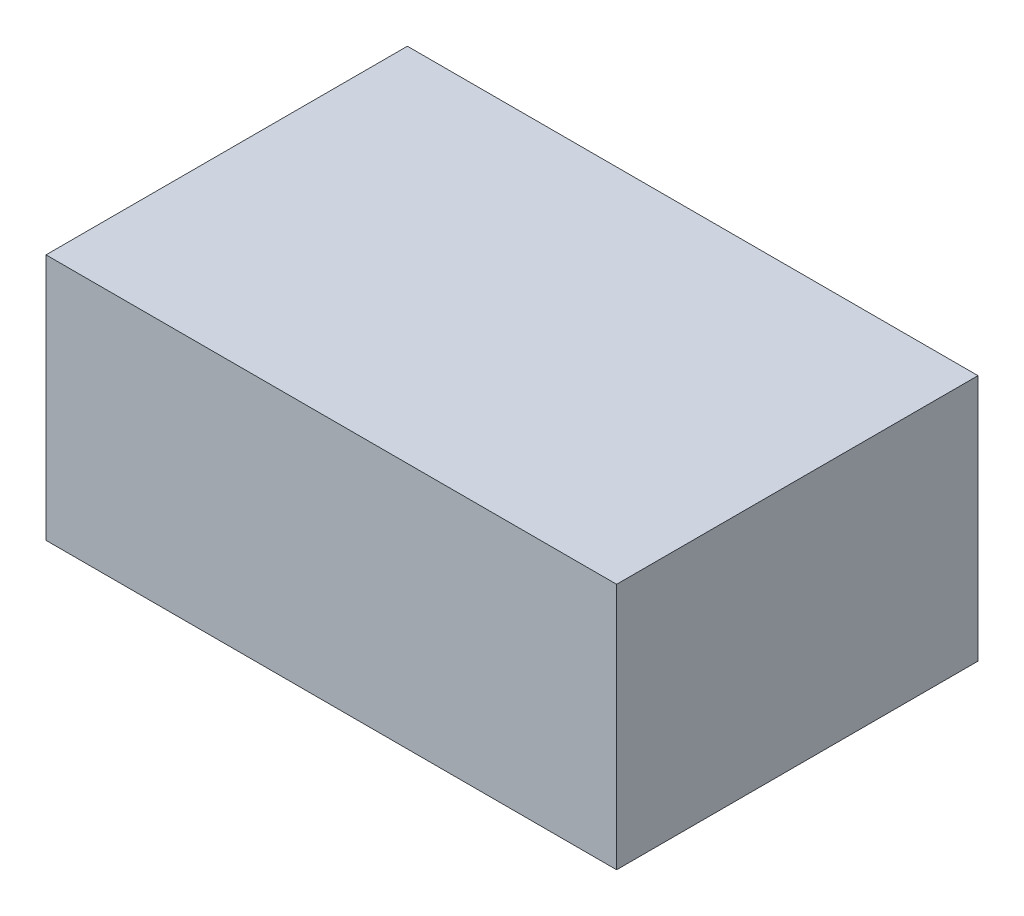
ISO-10303-21;
HEADER;
FILE_DESCRIPTION(('STEP AP214'),'2;1');
FILE_NAME('part.step','',(''),(''),'','','');
FILE_SCHEMA(('AUTOMOTIVE_DESIGN { 1 0 10303 214 1 1 1 1 }'));
ENDSEC;
DATA;
#1=APPLICATION_CONTEXT('core data for automotive mechanical design processes');
#2=APPLICATION_PROTOCOL_DEFINITION('international standard','automotive_design',2000,#1);
#3=PRODUCT_CONTEXT('',#1,'mechanical');
#4=PRODUCT('Part','Part','',(#3));
#5=PRODUCT_RELATED_PRODUCT_CATEGORY('part','',(#4));
#6=PRODUCT_DEFINITION_FORMATION('','',#4);
#7=PRODUCT_DEFINITION_CONTEXT('part definition',#1,'design');
#8=PRODUCT_DEFINITION('design','',#6,#7);
#9=PRODUCT_DEFINITION_SHAPE('','',#8);
#10=(LENGTH_UNIT() NAMED_UNIT(*) SI_UNIT(.MILLI.,.METRE.));
#11=(NAMED_UNIT(*) PLANE_ANGLE_UNIT() SI_UNIT($,.RADIAN.));
#12=(NAMED_UNIT(*) SI_UNIT($,.STERADIAN.) SOLID_ANGLE_UNIT());
#13=UNCERTAINTY_MEASURE_WITH_UNIT(LENGTH_MEASURE(1.E-05),#10,'distance_accuracy_value','');
#14=(GEOMETRIC_REPRESENTATION_CONTEXT(3) GLOBAL_UNCERTAINTY_ASSIGNED_CONTEXT((#13)) GLOBAL_UNIT_ASSIGNED_CONTEXT((#10,
#11,#12)) REPRESENTATION_CONTEXT('',''));
#15=CARTESIAN_POINT('',(0.,0.,0.));
#16=DIRECTION('',(0.,0.,1.));
#17=DIRECTION('',(1.,0.,0.));
#18=AXIS2_PLACEMENT_3D('',#15,#16,#17);
#19=CARTESIAN_POINT('',(-66.8924152908515,34.5673095776747,95.));
#20=DIRECTION('',(1.,0.,0.));
#21=DIRECTION('',(0.,1.,0.));
#22=AXIS2_PLACEMENT_3D('',#19,#20,#21);
#23=PLANE('',#22);
#24=DIRECTION('',(0.,-1.,0.));
#25=VECTOR('',#24,1.);
#26=CARTESIAN_POINT('',(-66.8924152908515,34.5673095776747,0.));
#27=LINE('',#26,#25);
#28=CARTESIAN_POINT('',(-66.8924152908515,34.5673095776747,0.));
#29=VERTEX_POINT('',#28);
#30=CARTESIAN_POINT('',(-66.8924152908515,-30.4326904223253,0.));
#31=VERTEX_POINT('',#30);
#32=EDGE_CURVE('E95',#29,#31,#27,.T.);
#33=ORIENTED_EDGE('',*,*,#32,.T.);
#34=DIRECTION('',(0.,0.,-1.));
#35=VECTOR('',#34,1.);
#36=CARTESIAN_POINT('',(-66.8924152908515,-30.4326904223253,95.));
#37=LINE('',#36,#35);
#38=CARTESIAN_POINT('',(-66.8924152908515,-30.4326904223253,95.));
#39=VERTEX_POINT('',#38);
#40=EDGE_CURVE('E11',#39,#31,#37,.T.);
#41=ORIENTED_EDGE('',*,*,#40,.F.);
#42=DIRECTION('',(0.,-1.,0.));
#43=VECTOR('',#42,1.);
#44=CARTESIAN_POINT('',(-66.8924152908515,34.5673095776747,95.));
#45=LINE('',#44,#43);
#46=CARTESIAN_POINT('',(-66.8924152908515,34.5673095776747,95.));
#47=VERTEX_POINT('',#46);
#48=EDGE_CURVE('E83',#47,#39,#45,.T.);
#49=ORIENTED_EDGE('',*,*,#48,.F.);
#50=DIRECTION('',(0.,0.,-1.));
#51=VECTOR('',#50,1.);
#52=CARTESIAN_POINT('',(-66.8924152908515,34.5673095776747,95.));
#53=LINE('',#52,#51);
#54=EDGE_CURVE('E91',#47,#29,#53,.T.);
#55=ORIENTED_EDGE('',*,*,#54,.T.);
#56=EDGE_LOOP('',(#33,#41,#49,#55));
#57=FACE_BOUND('',#56,.T.);
#58=ADVANCED_FACE('F32',(#57),#23,.F.);
#59=CARTESIAN_POINT('',(-66.8924152908515,-30.4326904223253,95.));
#60=DIRECTION('',(0.,1.,0.));
#61=DIRECTION('',(0.,0.,1.));
#62=AXIS2_PLACEMENT_3D('',#59,#60,#61);
#63=PLANE('',#62);
#64=DIRECTION('',(1.,0.,0.));
#65=VECTOR('',#64,1.);
#66=CARTESIAN_POINT('',(-66.8924152908515,-30.4326904223253,0.));
#67=LINE('',#66,#65);
#68=CARTESIAN_POINT('',(83.1075847091485,-30.4326904223253,0.));
#69=VERTEX_POINT('',#68);
#70=EDGE_CURVE('E87',#31,#69,#67,.T.);
#71=ORIENTED_EDGE('',*,*,#70,.T.);
#72=DIRECTION('',(0.,0.,-1.));
#73=VECTOR('',#72,1.);
#74=CARTESIAN_POINT('',(83.1075847091485,-30.4326904223253,95.));
#75=LINE('',#74,#73);
#76=CARTESIAN_POINT('',(83.1075847091485,-30.4326904223253,95.));
#77=VERTEX_POINT('',#76);
#78=EDGE_CURVE('E40',#77,#69,#75,.T.);
#79=ORIENTED_EDGE('',*,*,#78,.F.);
#80=DIRECTION('',(1.,0.,0.));
#81=VECTOR('',#80,1.);
#82=CARTESIAN_POINT('',(-66.8924152908515,-30.4326904223253,95.));
#83=LINE('',#82,#81);
#84=EDGE_CURVE('E78',#39,#77,#83,.T.);
#85=ORIENTED_EDGE('',*,*,#84,.F.);
#86=ORIENTED_EDGE('',*,*,#40,.T.);
#87=EDGE_LOOP('',(#71,#79,#85,#86));
#88=FACE_BOUND('',#87,.T.);
#89=ADVANCED_FACE('F86',(#88),#63,.F.);
#90=CARTESIAN_POINT('',(83.1075847091485,34.5673095776747,95.));
#91=DIRECTION('',(-1.,0.,0.));
#92=DIRECTION('',(0.,-1.,0.));
#93=AXIS2_PLACEMENT_3D('',#90,#91,#92);
#94=PLANE('',#93);
#95=DIRECTION('',(0.,1.,0.));
#96=VECTOR('',#95,1.);
#97=CARTESIAN_POINT('',(83.1075847091485,34.5673095776747,0.));
#98=LINE('',#97,#96);
#99=CARTESIAN_POINT('',(83.1075847091485,34.5673095776747,0.));
#100=VERTEX_POINT('',#99);
#101=EDGE_CURVE('E65',#69,#100,#98,.T.);
#102=ORIENTED_EDGE('',*,*,#101,.T.);
#103=DIRECTION('',(0.,0.,-1.));
#104=VECTOR('',#103,1.);
#105=CARTESIAN_POINT('',(83.1075847091485,34.5673095776747,95.));
#106=LINE('',#105,#104);
#107=CARTESIAN_POINT('',(83.1075847091485,34.5673095776747,95.));
#108=VERTEX_POINT('',#107);
#109=EDGE_CURVE('E88',#108,#100,#106,.T.);
#110=ORIENTED_EDGE('',*,*,#109,.F.);
#111=DIRECTION('',(0.,1.,0.));
#112=VECTOR('',#111,1.);
#113=CARTESIAN_POINT('',(83.1075847091485,34.5673095776747,95.));
#114=LINE('',#113,#112);
#115=EDGE_CURVE('E81',#77,#108,#114,.T.);
#116=ORIENTED_EDGE('',*,*,#115,.F.);
#117=ORIENTED_EDGE('',*,*,#78,.T.);
#118=EDGE_LOOP('',(#102,#110,#116,#117));
#119=FACE_BOUND('',#118,.T.);
#120=ADVANCED_FACE('F89',(#119),#94,.F.);
#121=CARTESIAN_POINT('',(-66.8924152908515,34.5673095776747,95.));
#122=DIRECTION('',(0.,-1.,0.));
#123=DIRECTION('',(0.,0.,-1.));
#124=AXIS2_PLACEMENT_3D('',#121,#122,#123);
#125=PLANE('',#124);
#126=DIRECTION('',(-1.,0.,0.));
#127=VECTOR('',#126,1.);
#128=CARTESIAN_POINT('',(-66.8924152908515,34.5673095776747,0.));
#129=LINE('',#128,#127);
#130=EDGE_CURVE('E71',#100,#29,#129,.T.);
#131=ORIENTED_EDGE('',*,*,#130,.T.);
#132=ORIENTED_EDGE('',*,*,#54,.F.);
#133=DIRECTION('',(-1.,0.,0.));
#134=VECTOR('',#133,1.);
#135=CARTESIAN_POINT('',(-66.8924152908515,34.5673095776747,95.));
#136=LINE('',#135,#134);
#137=EDGE_CURVE('E48',#108,#47,#136,.T.);
#138=ORIENTED_EDGE('',*,*,#137,.F.);
#139=ORIENTED_EDGE('',*,*,#109,.T.);
#140=EDGE_LOOP('',(#131,#132,#138,#139));
#141=FACE_BOUND('',#140,.T.);
#142=ADVANCED_FACE('F102',(#141),#125,.F.);
#143=CARTESIAN_POINT('',(-66.8924152908515,-30.4326904223253,95.));
#144=DIRECTION('',(0.,0.,1.));
#145=DIRECTION('',(1.,0.,0.));
#146=AXIS2_PLACEMENT_3D('',#143,#144,#145);
#147=PLANE('',#146);
#148=ORIENTED_EDGE('',*,*,#48,.T.);
#149=ORIENTED_EDGE('',*,*,#84,.T.);
#150=ORIENTED_EDGE('',*,*,#115,.T.);
#151=ORIENTED_EDGE('',*,*,#137,.T.);
#152=EDGE_LOOP('',(#148,#149,#150,#151));
#153=FACE_BOUND('',#152,.T.);
#154=ADVANCED_FACE('F79',(#153),#147,.T.);
#155=CARTESIAN_POINT('',(-66.8924152908515,-30.4326904223253,0.));
#156=DIRECTION('',(0.,0.,1.));
#157=DIRECTION('',(1.,0.,0.));
#158=AXIS2_PLACEMENT_3D('',#155,#156,#157);
#159=PLANE('',#158);
#160=ORIENTED_EDGE('',*,*,#32,.F.);
#161=ORIENTED_EDGE('',*,*,#130,.F.);
#162=ORIENTED_EDGE('',*,*,#101,.F.);
#163=ORIENTED_EDGE('',*,*,#70,.F.);
#164=EDGE_LOOP('',(#160,#161,#162,#163));
#165=FACE_BOUND('',#164,.T.);
#166=ADVANCED_FACE('F105',(#165),#159,.F.);
#167=CLOSED_SHELL('',(#58,#89,#120,#142,#154,#166));
#168=MANIFOLD_SOLID_BREP('B2',#167);
#169=ADVANCED_BREP_SHAPE_REPRESENTATION('',(#18,#168),#14);
#170=SHAPE_DEFINITION_REPRESENTATION(#9,#169);
ENDSEC;
END-ISO-10303-21;
